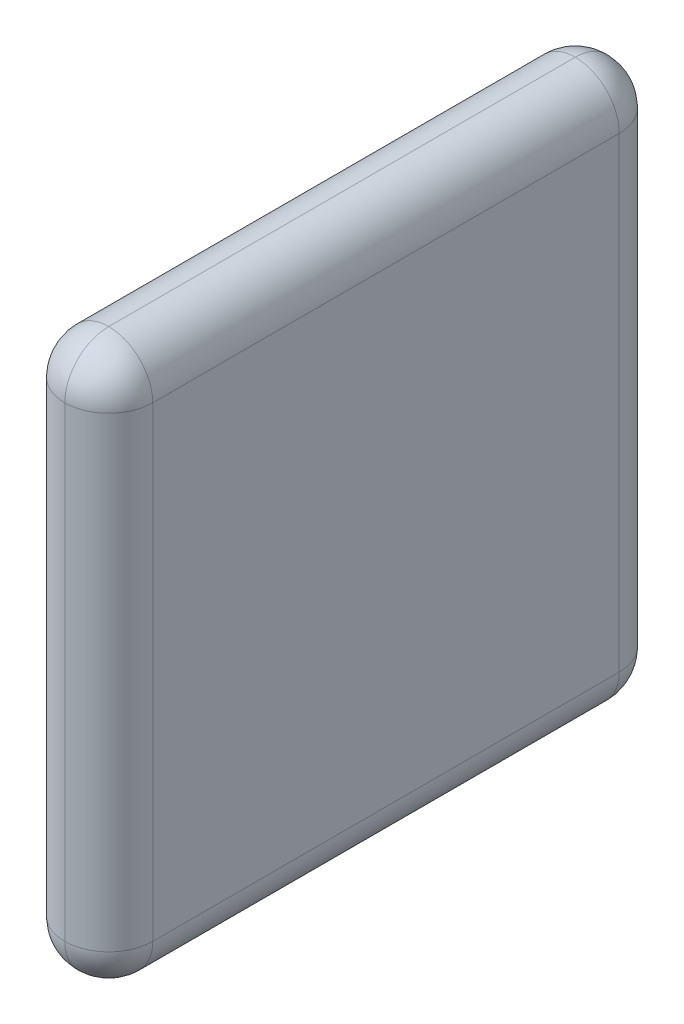
ISO-10303-21;
HEADER;
FILE_DESCRIPTION(('STEP AP214'),'2;1');
FILE_NAME('part.step','',(''),(''),'','','');
FILE_SCHEMA(('AUTOMOTIVE_DESIGN { 1 0 10303 214 1 1 1 1 }'));
ENDSEC;
DATA;
#1=APPLICATION_CONTEXT('core data for automotive mechanical design processes');
#2=APPLICATION_PROTOCOL_DEFINITION('international standard','automotive_design',2000,#1);
#3=PRODUCT_CONTEXT('',#1,'mechanical');
#4=PRODUCT('Part','Part','',(#3));
#5=PRODUCT_RELATED_PRODUCT_CATEGORY('part','',(#4));
#6=PRODUCT_DEFINITION_FORMATION('','',#4);
#7=PRODUCT_DEFINITION_CONTEXT('part definition',#1,'design');
#8=PRODUCT_DEFINITION('design','',#6,#7);
#9=PRODUCT_DEFINITION_SHAPE('','',#8);
#10=(LENGTH_UNIT() NAMED_UNIT(*) SI_UNIT(.MILLI.,.METRE.));
#11=(NAMED_UNIT(*) PLANE_ANGLE_UNIT() SI_UNIT($,.RADIAN.));
#12=(NAMED_UNIT(*) SI_UNIT($,.STERADIAN.) SOLID_ANGLE_UNIT());
#13=UNCERTAINTY_MEASURE_WITH_UNIT(LENGTH_MEASURE(1.E-05),#10,'distance_accuracy_value','');
#14=(GEOMETRIC_REPRESENTATION_CONTEXT(3) GLOBAL_UNCERTAINTY_ASSIGNED_CONTEXT((#13)) GLOBAL_UNIT_ASSIGNED_CONTEXT((#10,
#11,#12)) REPRESENTATION_CONTEXT('',''));
#15=CARTESIAN_POINT('',(0.,0.,0.));
#16=DIRECTION('',(0.,0.,1.));
#17=DIRECTION('',(1.,0.,0.));
#18=AXIS2_PLACEMENT_3D('',#15,#16,#17);
#19=CARTESIAN_POINT('',(1.,0.,0.));
#20=DIRECTION('',(-1.,0.,0.));
#21=DIRECTION('',(0.,0.,1.));
#22=AXIS2_PLACEMENT_3D('',#19,#20,#21);
#23=PLANE('',#22);
#24=DIRECTION('',(0.,-1.,0.));
#25=VECTOR('',#24,1.);
#26=CARTESIAN_POINT('',(1.,0.,2.65));
#27=LINE('',#26,#25);
#28=CARTESIAN_POINT('',(1.,2.65,2.65));
#29=VERTEX_POINT('',#28);
#30=CARTESIAN_POINT('',(1.,-2.65,2.65));
#31=VERTEX_POINT('',#30);
#32=EDGE_CURVE('E125',#29,#31,#27,.T.);
#33=ORIENTED_EDGE('',*,*,#32,.T.);
#34=DIRECTION('',(0.,0.,-1.));
#35=VECTOR('',#34,1.);
#36=CARTESIAN_POINT('',(1.,-2.65,0.));
#37=LINE('',#36,#35);
#38=CARTESIAN_POINT('',(1.,-2.65,-2.65));
#39=VERTEX_POINT('',#38);
#40=EDGE_CURVE('E114',#31,#39,#37,.T.);
#41=ORIENTED_EDGE('',*,*,#40,.T.);
#42=DIRECTION('',(0.,1.,0.));
#43=VECTOR('',#42,1.);
#44=CARTESIAN_POINT('',(1.,0.,-2.65));
#45=LINE('',#44,#43);
#46=CARTESIAN_POINT('',(1.,2.65,-2.65));
#47=VERTEX_POINT('',#46);
#48=EDGE_CURVE('E205',#39,#47,#45,.T.);
#49=ORIENTED_EDGE('',*,*,#48,.T.);
#50=DIRECTION('',(0.,0.,1.));
#51=VECTOR('',#50,1.);
#52=CARTESIAN_POINT('',(1.,2.65,0.));
#53=LINE('',#52,#51);
#54=EDGE_CURVE('E95',#47,#29,#53,.T.);
#55=ORIENTED_EDGE('',*,*,#54,.T.);
#56=EDGE_LOOP('',(#33,#41,#49,#55));
#57=FACE_BOUND('',#56,.T.);
#58=ADVANCED_FACE('F36',(#57),#23,.F.);
#59=CARTESIAN_POINT('',(0.,0.,0.));
#60=DIRECTION('',(-1.,0.,0.));
#61=DIRECTION('',(0.,0.,1.));
#62=AXIS2_PLACEMENT_3D('',#59,#60,#61);
#63=PLANE('',#62);
#64=DIRECTION('',(0.,1.,0.));
#65=VECTOR('',#64,1.);
#66=CARTESIAN_POINT('',(0.,-3.15,-2.65));
#67=LINE('',#66,#65);
#68=CARTESIAN_POINT('',(0.,2.65,-2.65));
#69=VERTEX_POINT('',#68);
#70=CARTESIAN_POINT('',(0.,-2.65,-2.65));
#71=VERTEX_POINT('',#70);
#72=EDGE_CURVE('E46',#69,#71,#67,.F.);
#73=ORIENTED_EDGE('',*,*,#72,.T.);
#74=DIRECTION('',(0.,0.,-1.));
#75=VECTOR('',#74,1.);
#76=CARTESIAN_POINT('',(0.,-2.65,3.15));
#77=LINE('',#76,#75);
#78=CARTESIAN_POINT('',(0.,-2.65,2.65));
#79=VERTEX_POINT('',#78);
#80=EDGE_CURVE('E11',#71,#79,#77,.F.);
#81=ORIENTED_EDGE('',*,*,#80,.T.);
#82=DIRECTION('',(0.,-1.,0.));
#83=VECTOR('',#82,1.);
#84=CARTESIAN_POINT('',(0.,3.15,2.65));
#85=LINE('',#84,#83);
#86=CARTESIAN_POINT('',(0.,2.65,2.65));
#87=VERTEX_POINT('',#86);
#88=EDGE_CURVE('E108',#79,#87,#85,.F.);
#89=ORIENTED_EDGE('',*,*,#88,.T.);
#90=DIRECTION('',(0.,0.,1.));
#91=VECTOR('',#90,1.);
#92=CARTESIAN_POINT('',(0.,2.65,-3.15));
#93=LINE('',#92,#91);
#94=EDGE_CURVE('E110',#87,#69,#93,.F.);
#95=ORIENTED_EDGE('',*,*,#94,.T.);
#96=EDGE_LOOP('',(#73,#81,#89,#95));
#97=FACE_BOUND('',#96,.T.);
#98=ADVANCED_FACE('F109',(#97),#63,.T.);
#99=CARTESIAN_POINT('',(0.5,2.65,3.15));
#100=DIRECTION('',(0.,0.,-1.));
#101=DIRECTION('',(-1.,0.,0.));
#102=AXIS2_PLACEMENT_3D('',#99,#100,#101);
#103=CYLINDRICAL_SURFACE('',#102,0.5);
#104=CARTESIAN_POINT('',(0.5,2.65,2.65));
#105=DIRECTION('',(0.,0.,1.));
#106=DIRECTION('',(1.,0.,0.));
#107=AXIS2_PLACEMENT_3D('',#104,#105,#106);
#108=CIRCLE('',#107,0.5);
#109=CARTESIAN_POINT('',(0.5,3.15,2.65));
#110=VERTEX_POINT('',#109);
#111=EDGE_CURVE('E40',#110,#87,#108,.T.);
#112=ORIENTED_EDGE('',*,*,#111,.F.);
#113=DIRECTION('',(0.,0.,1.));
#114=VECTOR('',#113,1.);
#115=CARTESIAN_POINT('',(0.5,3.15,3.15));
#116=LINE('',#115,#114);
#117=CARTESIAN_POINT('',(0.5,3.15,-2.65));
#118=VERTEX_POINT('',#117);
#119=EDGE_CURVE('E86',#118,#110,#116,.T.);
#120=ORIENTED_EDGE('',*,*,#119,.F.);
#121=CARTESIAN_POINT('',(0.5,2.65,-2.65));
#122=DIRECTION('',(0.,0.,-1.));
#123=DIRECTION('',(0.,1.,0.));
#124=AXIS2_PLACEMENT_3D('',#121,#122,#123);
#125=CIRCLE('',#124,0.5);
#126=EDGE_CURVE('E117',#69,#118,#125,.T.);
#127=ORIENTED_EDGE('',*,*,#126,.F.);
#128=ORIENTED_EDGE('',*,*,#94,.F.);
#129=EDGE_LOOP('',(#112,#120,#127,#128));
#130=FACE_BOUND('',#129,.T.);
#131=ADVANCED_FACE('F38',(#130),#103,.T.);
#132=CARTESIAN_POINT('',(0.5,2.65,2.65));
#133=DIRECTION('',(0.,0.,1.));
#134=DIRECTION('',(1.,0.,0.));
#135=AXIS2_PLACEMENT_3D('',#132,#133,#134);
#136=SPHERICAL_SURFACE('',#135,0.5);
#137=CARTESIAN_POINT('',(0.5,2.65,2.65));
#138=DIRECTION('',(-1.,0.,0.));
#139=DIRECTION('',(0.,0.,1.));
#140=AXIS2_PLACEMENT_3D('',#137,#138,#139);
#141=CIRCLE('',#140,0.5);
#142=CARTESIAN_POINT('',(0.5,2.65,3.15));
#143=VERTEX_POINT('',#142);
#144=EDGE_CURVE('E124',#110,#143,#141,.F.);
#145=ORIENTED_EDGE('',*,*,#144,.F.);
#146=ORIENTED_EDGE('',*,*,#111,.T.);
#147=CARTESIAN_POINT('',(0.5,2.65,2.65));
#148=DIRECTION('',(0.,1.,0.));
#149=DIRECTION('',(0.,0.,1.));
#150=AXIS2_PLACEMENT_3D('',#147,#148,#149);
#151=CIRCLE('',#150,0.5);
#152=EDGE_CURVE('E122',#143,#87,#151,.F.);
#153=ORIENTED_EDGE('',*,*,#152,.F.);
#154=EDGE_LOOP('',(#145,#146,#153));
#155=FACE_BOUND('',#154,.T.);
#156=ADVANCED_FACE('F121',(#155),#136,.T.);
#157=CARTESIAN_POINT('',(0.5,2.65,0.));
#158=DIRECTION('',(0.,0.,1.));
#159=DIRECTION('',(1.,0.,0.));
#160=AXIS2_PLACEMENT_3D('',#157,#158,#159);
#161=CYLINDRICAL_SURFACE('',#160,0.5);
#162=CARTESIAN_POINT('',(0.5,2.65,-2.65));
#163=DIRECTION('',(0.,0.,-1.));
#164=DIRECTION('',(-1.,0.,0.));
#165=AXIS2_PLACEMENT_3D('',#162,#163,#164);
#166=CIRCLE('',#165,0.5);
#167=EDGE_CURVE('E135',#118,#47,#166,.T.);
#168=ORIENTED_EDGE('',*,*,#167,.F.);
#169=ORIENTED_EDGE('',*,*,#119,.T.);
#170=CARTESIAN_POINT('',(0.5,2.65,2.65));
#171=DIRECTION('',(0.,0.,1.));
#172=DIRECTION('',(1.,0.,0.));
#173=AXIS2_PLACEMENT_3D('',#170,#171,#172);
#174=CIRCLE('',#173,0.5);
#175=EDGE_CURVE('E131',#29,#110,#174,.T.);
#176=ORIENTED_EDGE('',*,*,#175,.F.);
#177=ORIENTED_EDGE('',*,*,#54,.F.);
#178=EDGE_LOOP('',(#168,#169,#176,#177));
#179=FACE_BOUND('',#178,.T.);
#180=ADVANCED_FACE('F146',(#179),#161,.T.);
#181=CARTESIAN_POINT('',(0.5,2.65,-2.65));
#182=DIRECTION('',(0.,0.,1.));
#183=DIRECTION('',(1.,0.,0.));
#184=AXIS2_PLACEMENT_3D('',#181,#182,#183);
#185=SPHERICAL_SURFACE('',#184,0.5);
#186=ORIENTED_EDGE('',*,*,#126,.T.);
#187=CARTESIAN_POINT('',(0.5,2.65,-2.65));
#188=DIRECTION('',(1.,0.,0.));
#189=DIRECTION('',(0.,0.,-1.));
#190=AXIS2_PLACEMENT_3D('',#187,#188,#189);
#191=CIRCLE('',#190,0.5);
#192=CARTESIAN_POINT('',(0.5,2.65,-3.15));
#193=VERTEX_POINT('',#192);
#194=EDGE_CURVE('E151',#193,#118,#191,.T.);
#195=ORIENTED_EDGE('',*,*,#194,.F.);
#196=CARTESIAN_POINT('',(0.5,2.65,-2.65));
#197=DIRECTION('',(0.,1.,0.));
#198=DIRECTION('',(0.,0.,1.));
#199=AXIS2_PLACEMENT_3D('',#196,#197,#198);
#200=CIRCLE('',#199,0.5);
#201=EDGE_CURVE('E155',#69,#193,#200,.F.);
#202=ORIENTED_EDGE('',*,*,#201,.F.);
#203=EDGE_LOOP('',(#186,#195,#202));
#204=FACE_BOUND('',#203,.T.);
#205=ADVANCED_FACE('F153',(#204),#185,.T.);
#206=CARTESIAN_POINT('',(0.5,-3.15,2.65));
#207=DIRECTION('',(0.,1.,0.));
#208=DIRECTION('',(0.,0.,1.));
#209=AXIS2_PLACEMENT_3D('',#206,#207,#208);
#210=CYLINDRICAL_SURFACE('',#209,0.5);
#211=ORIENTED_EDGE('',*,*,#152,.T.);
#212=ORIENTED_EDGE('',*,*,#88,.F.);
#213=CARTESIAN_POINT('',(0.5,-2.65,2.65));
#214=DIRECTION('',(0.,-1.,0.));
#215=DIRECTION('',(0.,0.,-1.));
#216=AXIS2_PLACEMENT_3D('',#213,#214,#215);
#217=CIRCLE('',#216,0.5);
#218=CARTESIAN_POINT('',(0.5,-2.65,3.15));
#219=VERTEX_POINT('',#218);
#220=EDGE_CURVE('E196',#219,#79,#217,.T.);
#221=ORIENTED_EDGE('',*,*,#220,.F.);
#222=DIRECTION('',(0.,-1.,0.));
#223=VECTOR('',#222,1.);
#224=CARTESIAN_POINT('',(0.5,-3.15,3.15));
#225=LINE('',#224,#223);
#226=EDGE_CURVE('E129',#143,#219,#225,.T.);
#227=ORIENTED_EDGE('',*,*,#226,.F.);
#228=EDGE_LOOP('',(#211,#212,#221,#227));
#229=FACE_BOUND('',#228,.T.);
#230=ADVANCED_FACE('F127',(#229),#210,.T.);
#231=CARTESIAN_POINT('',(0.5,2.65,2.65));
#232=DIRECTION('',(0.,0.,1.));
#233=DIRECTION('',(1.,0.,0.));
#234=AXIS2_PLACEMENT_3D('',#231,#232,#233);
#235=SPHERICAL_SURFACE('',#234,0.5);
#236=ORIENTED_EDGE('',*,*,#175,.T.);
#237=ORIENTED_EDGE('',*,*,#144,.T.);
#238=CARTESIAN_POINT('',(0.5,2.65,2.65));
#239=DIRECTION('',(0.,1.,0.));
#240=DIRECTION('',(-1.,0.,0.));
#241=AXIS2_PLACEMENT_3D('',#238,#239,#240);
#242=CIRCLE('',#241,0.5);
#243=EDGE_CURVE('E142',#29,#143,#242,.F.);
#244=ORIENTED_EDGE('',*,*,#243,.F.);
#245=EDGE_LOOP('',(#236,#237,#244));
#246=FACE_BOUND('',#245,.T.);
#247=ADVANCED_FACE('F141',(#246),#235,.T.);
#248=CARTESIAN_POINT('',(0.5,2.65,-2.65));
#249=DIRECTION('',(0.,0.,1.));
#250=DIRECTION('',(1.,0.,0.));
#251=AXIS2_PLACEMENT_3D('',#248,#249,#250);
#252=SPHERICAL_SURFACE('',#251,0.5);
#253=ORIENTED_EDGE('',*,*,#194,.T.);
#254=ORIENTED_EDGE('',*,*,#167,.T.);
#255=CARTESIAN_POINT('',(0.5,2.65,-2.65));
#256=DIRECTION('',(0.,1.,0.));
#257=DIRECTION('',(0.,0.,1.));
#258=AXIS2_PLACEMENT_3D('',#255,#256,#257);
#259=CIRCLE('',#258,0.5);
#260=EDGE_CURVE('E189',#193,#47,#259,.F.);
#261=ORIENTED_EDGE('',*,*,#260,.F.);
#262=EDGE_LOOP('',(#253,#254,#261));
#263=FACE_BOUND('',#262,.T.);
#264=ADVANCED_FACE('F200',(#263),#252,.T.);
#265=CARTESIAN_POINT('',(0.5,-3.15,-2.65));
#266=DIRECTION('',(0.,-1.,0.));
#267=DIRECTION('',(0.,0.,-1.));
#268=AXIS2_PLACEMENT_3D('',#265,#266,#267);
#269=CYLINDRICAL_SURFACE('',#268,0.5);
#270=CARTESIAN_POINT('',(0.5,-2.65,-2.65));
#271=DIRECTION('',(0.,-1.,0.));
#272=DIRECTION('',(0.,0.,-1.));
#273=AXIS2_PLACEMENT_3D('',#270,#271,#272);
#274=CIRCLE('',#273,0.5);
#275=CARTESIAN_POINT('',(0.5,-2.65,-3.15));
#276=VERTEX_POINT('',#275);
#277=EDGE_CURVE('E158',#71,#276,#274,.T.);
#278=ORIENTED_EDGE('',*,*,#277,.F.);
#279=ORIENTED_EDGE('',*,*,#72,.F.);
#280=ORIENTED_EDGE('',*,*,#201,.T.);
#281=DIRECTION('',(0.,1.,0.));
#282=VECTOR('',#281,1.);
#283=CARTESIAN_POINT('',(0.5,3.15,-3.15));
#284=LINE('',#283,#282);
#285=EDGE_CURVE('E186',#276,#193,#284,.T.);
#286=ORIENTED_EDGE('',*,*,#285,.F.);
#287=EDGE_LOOP('',(#278,#279,#280,#286));
#288=FACE_BOUND('',#287,.T.);
#289=ADVANCED_FACE('F160',(#288),#269,.T.);
#290=CARTESIAN_POINT('',(0.5,-2.65,-2.65));
#291=DIRECTION('',(0.,0.,1.));
#292=DIRECTION('',(1.,0.,0.));
#293=AXIS2_PLACEMENT_3D('',#290,#291,#292);
#294=SPHERICAL_SURFACE('',#293,0.5);
#295=CARTESIAN_POINT('',(0.5,-2.65,-2.65));
#296=DIRECTION('',(0.,0.,-1.));
#297=DIRECTION('',(-1.,0.,0.));
#298=AXIS2_PLACEMENT_3D('',#295,#296,#297);
#299=CIRCLE('',#298,0.5);
#300=CARTESIAN_POINT('',(0.5,-3.15,-2.65));
#301=VERTEX_POINT('',#300);
#302=EDGE_CURVE('E180',#71,#301,#299,.F.);
#303=ORIENTED_EDGE('',*,*,#302,.F.);
#304=ORIENTED_EDGE('',*,*,#277,.T.);
#305=CARTESIAN_POINT('',(0.5,-2.65,-2.65));
#306=DIRECTION('',(-1.,0.,0.));
#307=DIRECTION('',(0.,0.,1.));
#308=AXIS2_PLACEMENT_3D('',#305,#306,#307);
#309=CIRCLE('',#308,0.5);
#310=EDGE_CURVE('E183',#301,#276,#309,.F.);
#311=ORIENTED_EDGE('',*,*,#310,.F.);
#312=EDGE_LOOP('',(#303,#304,#311));
#313=FACE_BOUND('',#312,.T.);
#314=ADVANCED_FACE('F211',(#313),#294,.T.);
#315=CARTESIAN_POINT('',(0.5,-2.65,2.65));
#316=DIRECTION('',(0.,0.,1.));
#317=DIRECTION('',(1.,0.,0.));
#318=AXIS2_PLACEMENT_3D('',#315,#316,#317);
#319=SPHERICAL_SURFACE('',#318,0.5);
#320=CARTESIAN_POINT('',(0.5,-2.65,2.65));
#321=DIRECTION('',(-1.,0.,0.));
#322=DIRECTION('',(0.,0.,1.));
#323=AXIS2_PLACEMENT_3D('',#320,#321,#322);
#324=CIRCLE('',#323,0.5);
#325=CARTESIAN_POINT('',(0.5,-3.15,2.65));
#326=VERTEX_POINT('',#325);
#327=EDGE_CURVE('E193',#219,#326,#324,.F.);
#328=ORIENTED_EDGE('',*,*,#327,.F.);
#329=ORIENTED_EDGE('',*,*,#220,.T.);
#330=CARTESIAN_POINT('',(0.5,-2.65,2.65));
#331=DIRECTION('',(0.,0.,1.));
#332=DIRECTION('',(1.,0.,0.));
#333=AXIS2_PLACEMENT_3D('',#330,#331,#332);
#334=CIRCLE('',#333,0.5);
#335=EDGE_CURVE('E178',#326,#79,#334,.F.);
#336=ORIENTED_EDGE('',*,*,#335,.F.);
#337=EDGE_LOOP('',(#328,#329,#336));
#338=FACE_BOUND('',#337,.T.);
#339=ADVANCED_FACE('F224',(#338),#319,.T.);
#340=CARTESIAN_POINT('',(0.5,0.,2.65));
#341=DIRECTION('',(0.,-1.,0.));
#342=DIRECTION('',(0.,0.,-1.));
#343=AXIS2_PLACEMENT_3D('',#340,#341,#342);
#344=CYLINDRICAL_SURFACE('',#343,0.5);
#345=ORIENTED_EDGE('',*,*,#243,.T.);
#346=ORIENTED_EDGE('',*,*,#226,.T.);
#347=CARTESIAN_POINT('',(0.5,-2.65,2.65));
#348=DIRECTION('',(0.,-1.,0.));
#349=DIRECTION('',(0.,0.,-1.));
#350=AXIS2_PLACEMENT_3D('',#347,#348,#349);
#351=CIRCLE('',#350,0.5);
#352=EDGE_CURVE('E175',#31,#219,#351,.T.);
#353=ORIENTED_EDGE('',*,*,#352,.F.);
#354=ORIENTED_EDGE('',*,*,#32,.F.);
#355=EDGE_LOOP('',(#345,#346,#353,#354));
#356=FACE_BOUND('',#355,.T.);
#357=ADVANCED_FACE('F226',(#356),#344,.T.);
#358=CARTESIAN_POINT('',(0.5,0.,-2.65));
#359=DIRECTION('',(0.,1.,0.));
#360=DIRECTION('',(0.,0.,1.));
#361=AXIS2_PLACEMENT_3D('',#358,#359,#360);
#362=CYLINDRICAL_SURFACE('',#361,0.5);
#363=ORIENTED_EDGE('',*,*,#260,.T.);
#364=ORIENTED_EDGE('',*,*,#48,.F.);
#365=CARTESIAN_POINT('',(0.5,-2.65,-2.65));
#366=DIRECTION('',(0.,-1.,0.));
#367=DIRECTION('',(0.,0.,-1.));
#368=AXIS2_PLACEMENT_3D('',#365,#366,#367);
#369=CIRCLE('',#368,0.5);
#370=EDGE_CURVE('E172',#276,#39,#369,.T.);
#371=ORIENTED_EDGE('',*,*,#370,.F.);
#372=ORIENTED_EDGE('',*,*,#285,.T.);
#373=EDGE_LOOP('',(#363,#364,#371,#372));
#374=FACE_BOUND('',#373,.T.);
#375=ADVANCED_FACE('F204',(#374),#362,.T.);
#376=CARTESIAN_POINT('',(0.5,-2.65,3.15));
#377=DIRECTION('',(0.,0.,1.));
#378=DIRECTION('',(1.,0.,0.));
#379=AXIS2_PLACEMENT_3D('',#376,#377,#378);
#380=CYLINDRICAL_SURFACE('',#379,0.5);
#381=ORIENTED_EDGE('',*,*,#80,.F.);
#382=ORIENTED_EDGE('',*,*,#302,.T.);
#383=DIRECTION('',(0.,0.,-1.));
#384=VECTOR('',#383,1.);
#385=CARTESIAN_POINT('',(0.5,-3.15,-3.15));
#386=LINE('',#385,#384);
#387=EDGE_CURVE('E169',#326,#301,#386,.T.);
#388=ORIENTED_EDGE('',*,*,#387,.F.);
#389=ORIENTED_EDGE('',*,*,#335,.T.);
#390=EDGE_LOOP('',(#381,#382,#388,#389));
#391=FACE_BOUND('',#390,.T.);
#392=ADVANCED_FACE('F214',(#391),#380,.T.);
#393=CARTESIAN_POINT('',(0.5,-2.65,2.65));
#394=DIRECTION('',(0.,0.,1.));
#395=DIRECTION('',(1.,0.,0.));
#396=AXIS2_PLACEMENT_3D('',#393,#394,#395);
#397=SPHERICAL_SURFACE('',#396,0.5);
#398=ORIENTED_EDGE('',*,*,#352,.T.);
#399=ORIENTED_EDGE('',*,*,#327,.T.);
#400=CARTESIAN_POINT('',(0.5,-2.65,2.65));
#401=DIRECTION('',(0.,0.,1.));
#402=DIRECTION('',(1.,0.,0.));
#403=AXIS2_PLACEMENT_3D('',#400,#401,#402);
#404=CIRCLE('',#403,0.5);
#405=EDGE_CURVE('E166',#31,#326,#404,.F.);
#406=ORIENTED_EDGE('',*,*,#405,.F.);
#407=EDGE_LOOP('',(#398,#399,#406));
#408=FACE_BOUND('',#407,.T.);
#409=ADVANCED_FACE('F220',(#408),#397,.T.);
#410=CARTESIAN_POINT('',(0.5,-2.65,-2.65));
#411=DIRECTION('',(0.,0.,1.));
#412=DIRECTION('',(1.,0.,0.));
#413=AXIS2_PLACEMENT_3D('',#410,#411,#412);
#414=SPHERICAL_SURFACE('',#413,0.5);
#415=ORIENTED_EDGE('',*,*,#310,.T.);
#416=ORIENTED_EDGE('',*,*,#370,.T.);
#417=CARTESIAN_POINT('',(0.5,-2.65,-2.65));
#418=DIRECTION('',(0.,0.,-1.));
#419=DIRECTION('',(-1.,0.,0.));
#420=AXIS2_PLACEMENT_3D('',#417,#418,#419);
#421=CIRCLE('',#420,0.5);
#422=EDGE_CURVE('E164',#301,#39,#421,.F.);
#423=ORIENTED_EDGE('',*,*,#422,.F.);
#424=EDGE_LOOP('',(#415,#416,#423));
#425=FACE_BOUND('',#424,.T.);
#426=ADVANCED_FACE('F209',(#425),#414,.T.);
#427=CARTESIAN_POINT('',(0.5,-2.65,0.));
#428=DIRECTION('',(0.,0.,-1.));
#429=DIRECTION('',(-1.,0.,0.));
#430=AXIS2_PLACEMENT_3D('',#427,#428,#429);
#431=CYLINDRICAL_SURFACE('',#430,0.5);
#432=ORIENTED_EDGE('',*,*,#405,.T.);
#433=ORIENTED_EDGE('',*,*,#387,.T.);
#434=ORIENTED_EDGE('',*,*,#422,.T.);
#435=ORIENTED_EDGE('',*,*,#40,.F.);
#436=EDGE_LOOP('',(#432,#433,#434,#435));
#437=FACE_BOUND('',#436,.T.);
#438=ADVANCED_FACE('F216',(#437),#431,.T.);
#439=CLOSED_SHELL('',(#58,#98,#131,#156,#180,#205,#230,#247,#264,#289,#314,#339,#357,#375,#392,
#409,#426,#438));
#440=MANIFOLD_SOLID_BREP('B2',#439);
#441=ADVANCED_BREP_SHAPE_REPRESENTATION('',(#18,#440),#14);
#442=SHAPE_DEFINITION_REPRESENTATION(#9,#441);
ENDSEC;
END-ISO-10303-21;
